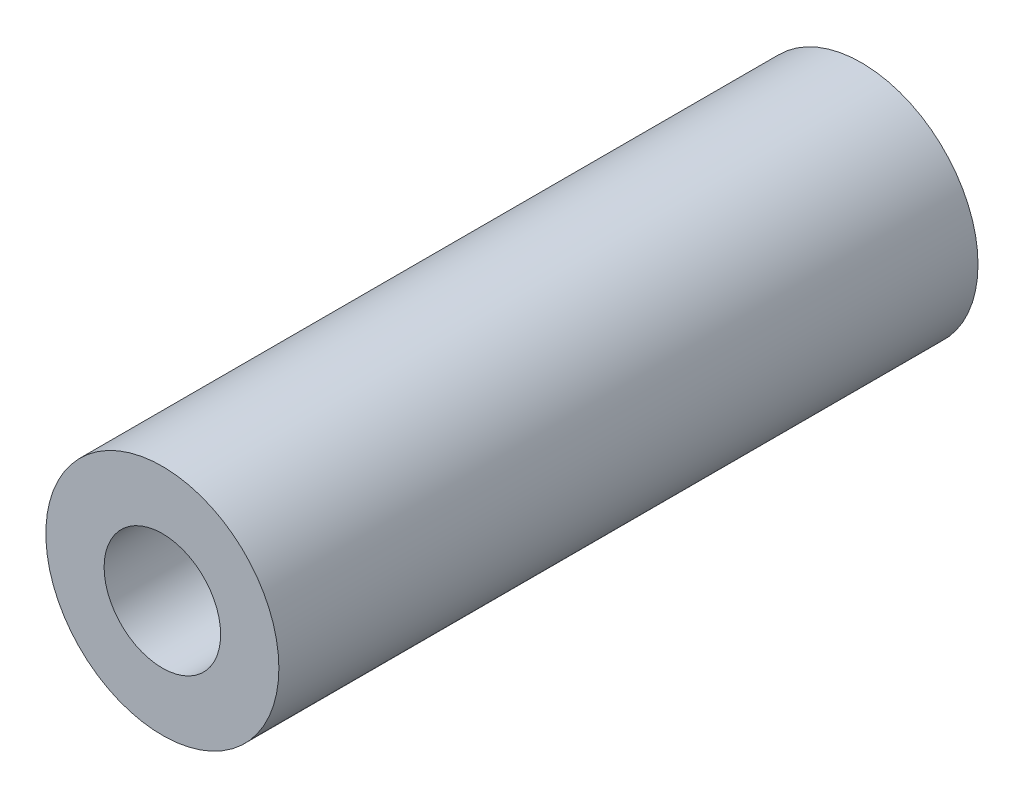
ISO-10303-21;
HEADER;
FILE_DESCRIPTION(('STEP AP214'),'2;1');
FILE_NAME('part.step','',(''),(''),'','','');
FILE_SCHEMA(('AUTOMOTIVE_DESIGN { 1 0 10303 214 1 1 1 1 }'));
ENDSEC;
DATA;
#1=APPLICATION_CONTEXT('core data for automotive mechanical design processes');
#2=APPLICATION_PROTOCOL_DEFINITION('international standard','automotive_design',2000,#1);
#3=PRODUCT_CONTEXT('',#1,'mechanical');
#4=PRODUCT('Part','Part','',(#3));
#5=PRODUCT_RELATED_PRODUCT_CATEGORY('part','',(#4));
#6=PRODUCT_DEFINITION_FORMATION('','',#4);
#7=PRODUCT_DEFINITION_CONTEXT('part definition',#1,'design');
#8=PRODUCT_DEFINITION('design','',#6,#7);
#9=PRODUCT_DEFINITION_SHAPE('','',#8);
#10=(LENGTH_UNIT() NAMED_UNIT(*) SI_UNIT(.MILLI.,.METRE.));
#11=(NAMED_UNIT(*) PLANE_ANGLE_UNIT() SI_UNIT($,.RADIAN.));
#12=(NAMED_UNIT(*) SI_UNIT($,.STERADIAN.) SOLID_ANGLE_UNIT());
#13=UNCERTAINTY_MEASURE_WITH_UNIT(LENGTH_MEASURE(1.E-05),#10,'distance_accuracy_value','');
#14=(GEOMETRIC_REPRESENTATION_CONTEXT(3) GLOBAL_UNCERTAINTY_ASSIGNED_CONTEXT((#13)) GLOBAL_UNIT_ASSIGNED_CONTEXT((#10,
#11,#12)) REPRESENTATION_CONTEXT('',''));
#15=CARTESIAN_POINT('',(0.,0.,0.));
#16=DIRECTION('',(0.,0.,1.));
#17=DIRECTION('',(1.,0.,0.));
#18=AXIS2_PLACEMENT_3D('',#15,#16,#17);
#19=CARTESIAN_POINT('',(0.,0.,30.));
#20=DIRECTION('',(0.,0.,-1.));
#21=DIRECTION('',(-1.,0.,0.));
#22=AXIS2_PLACEMENT_3D('',#19,#20,#21);
#23=CYLINDRICAL_SURFACE('',#22,5.);
#24=CARTESIAN_POINT('',(0.,0.,30.));
#25=DIRECTION('',(0.,0.,1.));
#26=DIRECTION('',(1.,0.,0.));
#27=AXIS2_PLACEMENT_3D('',#24,#25,#26);
#28=CIRCLE('',#27,5.);
#29=CARTESIAN_POINT('',(5.,0.,30.));
#30=VERTEX_POINT('',#29);
#31=EDGE_CURVE('E10',#30,#30,#28,.T.);
#32=ORIENTED_EDGE('',*,*,#31,.F.);
#33=EDGE_LOOP('',(#32));
#34=FACE_BOUND('',#33,.T.);
#35=CARTESIAN_POINT('',(0.,0.,0.));
#36=DIRECTION('',(0.,0.,1.));
#37=DIRECTION('',(1.,0.,0.));
#38=AXIS2_PLACEMENT_3D('',#35,#36,#37);
#39=CIRCLE('',#38,5.);
#40=CARTESIAN_POINT('',(5.,0.,0.));
#41=VERTEX_POINT('',#40);
#42=EDGE_CURVE('E39',#41,#41,#39,.T.);
#43=ORIENTED_EDGE('',*,*,#42,.T.);
#44=EDGE_LOOP('',(#43));
#45=FACE_BOUND('',#44,.T.);
#46=ADVANCED_FACE('F36',(#34,#45),#23,.T.);
#47=CARTESIAN_POINT('',(0.,0.,30.));
#48=DIRECTION('',(0.,0.,1.));
#49=DIRECTION('',(1.,0.,0.));
#50=AXIS2_PLACEMENT_3D('',#47,#48,#49);
#51=PLANE('',#50);
#52=CARTESIAN_POINT('',(0.,0.,30.));
#53=DIRECTION('',(0.,0.,1.));
#54=DIRECTION('',(1.,0.,0.));
#55=AXIS2_PLACEMENT_3D('',#52,#53,#54);
#56=CIRCLE('',#55,2.5);
#57=CARTESIAN_POINT('',(2.5,0.,30.));
#58=VERTEX_POINT('',#57);
#59=EDGE_CURVE('E50',#58,#58,#56,.F.);
#60=ORIENTED_EDGE('',*,*,#59,.T.);
#61=EDGE_LOOP('',(#60));
#62=FACE_BOUND('',#61,.T.);
#63=ORIENTED_EDGE('',*,*,#31,.T.);
#64=EDGE_LOOP('',(#63));
#65=FACE_BOUND('',#64,.T.);
#66=ADVANCED_FACE('F63',(#62,#65),#51,.T.);
#67=CARTESIAN_POINT('',(0.,0.,0.));
#68=DIRECTION('',(0.,0.,1.));
#69=DIRECTION('',(1.,0.,0.));
#70=AXIS2_PLACEMENT_3D('',#67,#68,#69);
#71=PLANE('',#70);
#72=CARTESIAN_POINT('',(0.,0.,0.));
#73=DIRECTION('',(0.,0.,-1.));
#74=DIRECTION('',(-1.,0.,0.));
#75=AXIS2_PLACEMENT_3D('',#72,#73,#74);
#76=CIRCLE('',#75,2.5);
#77=CARTESIAN_POINT('',(-2.5,0.,0.));
#78=VERTEX_POINT('',#77);
#79=EDGE_CURVE('E48',#78,#78,#76,.T.);
#80=ORIENTED_EDGE('',*,*,#79,.F.);
#81=EDGE_LOOP('',(#80));
#82=FACE_BOUND('',#81,.T.);
#83=ORIENTED_EDGE('',*,*,#42,.F.);
#84=EDGE_LOOP('',(#83));
#85=FACE_BOUND('',#84,.T.);
#86=ADVANCED_FACE('F60',(#82,#85),#71,.F.);
#87=CARTESIAN_POINT('',(0.,0.,30.001));
#88=DIRECTION('',(0.,0.,-1.));
#89=DIRECTION('',(-1.,0.,0.));
#90=AXIS2_PLACEMENT_3D('',#87,#88,#89);
#91=CYLINDRICAL_SURFACE('',#90,2.5);
#92=ORIENTED_EDGE('',*,*,#59,.F.);
#93=EDGE_LOOP('',(#92));
#94=FACE_BOUND('',#93,.T.);
#95=ORIENTED_EDGE('',*,*,#79,.T.);
#96=EDGE_LOOP('',(#95));
#97=FACE_BOUND('',#96,.T.);
#98=ADVANCED_FACE('F58',(#94,#97),#91,.F.);
#99=CLOSED_SHELL('',(#46,#66,#86,#98));
#100=MANIFOLD_SOLID_BREP('B2',#99);
#101=ADVANCED_BREP_SHAPE_REPRESENTATION('',(#18,#100),#14);
#102=SHAPE_DEFINITION_REPRESENTATION(#9,#101);
ENDSEC;
END-ISO-10303-21;
